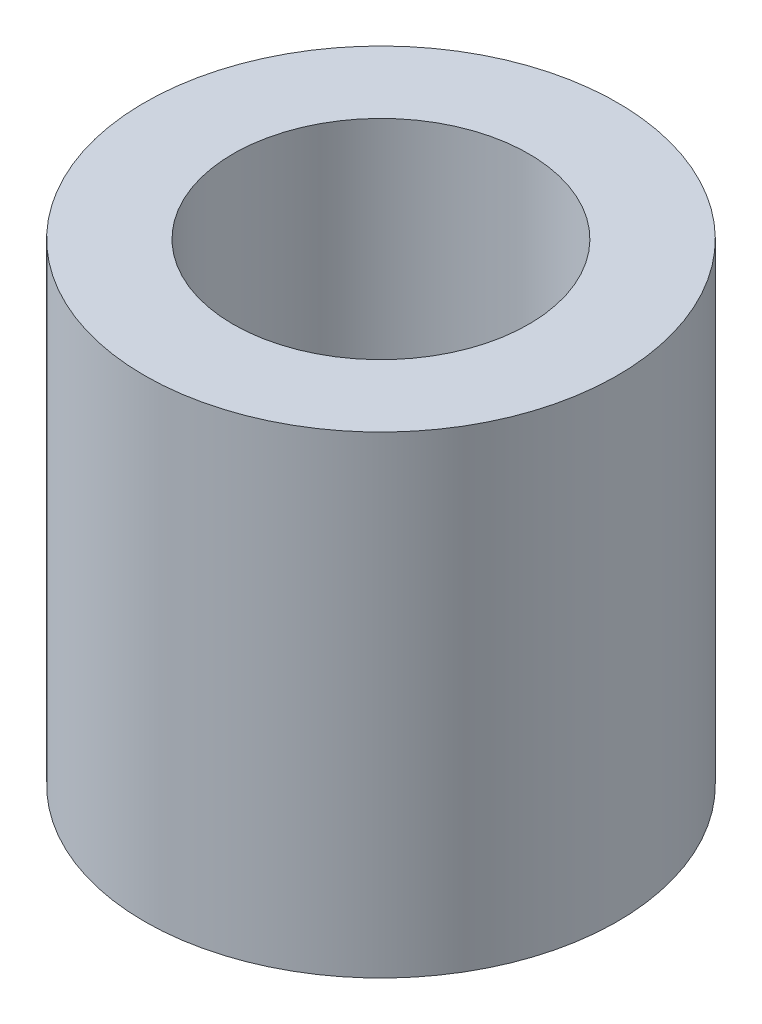
ISO-10303-21;
HEADER;
FILE_DESCRIPTION(('STEP AP214'),'2;1');
FILE_NAME('part.step','',(''),(''),'','','');
FILE_SCHEMA(('AUTOMOTIVE_DESIGN { 1 0 10303 214 1 1 1 1 }'));
ENDSEC;
DATA;
#1=APPLICATION_CONTEXT('core data for automotive mechanical design processes');
#2=APPLICATION_PROTOCOL_DEFINITION('international standard','automotive_design',2000,#1);
#3=PRODUCT_CONTEXT('',#1,'mechanical');
#4=PRODUCT('Part','Part','',(#3));
#5=PRODUCT_RELATED_PRODUCT_CATEGORY('part','',(#4));
#6=PRODUCT_DEFINITION_FORMATION('','',#4);
#7=PRODUCT_DEFINITION_CONTEXT('part definition',#1,'design');
#8=PRODUCT_DEFINITION('design','',#6,#7);
#9=PRODUCT_DEFINITION_SHAPE('','',#8);
#10=(LENGTH_UNIT() NAMED_UNIT(*) SI_UNIT(.MILLI.,.METRE.));
#11=(NAMED_UNIT(*) PLANE_ANGLE_UNIT() SI_UNIT($,.RADIAN.));
#12=(NAMED_UNIT(*) SI_UNIT($,.STERADIAN.) SOLID_ANGLE_UNIT());
#13=UNCERTAINTY_MEASURE_WITH_UNIT(LENGTH_MEASURE(1.E-05),#10,'distance_accuracy_value','');
#14=(GEOMETRIC_REPRESENTATION_CONTEXT(3) GLOBAL_UNCERTAINTY_ASSIGNED_CONTEXT((#13)) GLOBAL_UNIT_ASSIGNED_CONTEXT((#10,
#11,#12)) REPRESENTATION_CONTEXT('',''));
#15=CARTESIAN_POINT('',(0.,0.,0.));
#16=DIRECTION('',(0.,0.,1.));
#17=DIRECTION('',(1.,0.,0.));
#18=AXIS2_PLACEMENT_3D('',#15,#16,#17);
#19=CARTESIAN_POINT('',(0.,8.,0.));
#20=DIRECTION('',(0.,1.,0.));
#21=DIRECTION('',(0.,0.,1.));
#22=AXIS2_PLACEMENT_3D('',#19,#20,#21);
#23=PLANE('',#22);
#24=CARTESIAN_POINT('',(0.,8.,0.));
#25=DIRECTION('',(0.,1.,0.));
#26=DIRECTION('',(0.,0.,1.));
#27=AXIS2_PLACEMENT_3D('',#24,#25,#26);
#28=CIRCLE('',#27,4.);
#29=CARTESIAN_POINT('',(0.,8.,4.));
#30=VERTEX_POINT('',#29);
#31=EDGE_CURVE('E10',#30,#30,#28,.T.);
#32=ORIENTED_EDGE('',*,*,#31,.T.);
#33=EDGE_LOOP('',(#32));
#34=FACE_BOUND('',#33,.T.);
#35=CARTESIAN_POINT('',(0.,8.,0.));
#36=DIRECTION('',(0.,1.,0.));
#37=DIRECTION('',(0.,0.,1.));
#38=AXIS2_PLACEMENT_3D('',#35,#36,#37);
#39=CIRCLE('',#38,2.5);
#40=CARTESIAN_POINT('',(0.,8.,2.5));
#41=VERTEX_POINT('',#40);
#42=EDGE_CURVE('E44',#41,#41,#39,.T.);
#43=ORIENTED_EDGE('',*,*,#42,.F.);
#44=EDGE_LOOP('',(#43));
#45=FACE_BOUND('',#44,.T.);
#46=ADVANCED_FACE('F33',(#34,#45),#23,.T.);
#47=CARTESIAN_POINT('',(0.,0.,0.));
#48=DIRECTION('',(0.,1.,0.));
#49=DIRECTION('',(0.,0.,1.));
#50=AXIS2_PLACEMENT_3D('',#47,#48,#49);
#51=PLANE('',#50);
#52=CARTESIAN_POINT('',(0.,0.,0.));
#53=DIRECTION('',(0.,1.,0.));
#54=DIRECTION('',(0.,0.,1.));
#55=AXIS2_PLACEMENT_3D('',#52,#53,#54);
#56=CIRCLE('',#55,4.);
#57=CARTESIAN_POINT('',(0.,0.,4.));
#58=VERTEX_POINT('',#57);
#59=EDGE_CURVE('E37',#58,#58,#56,.T.);
#60=ORIENTED_EDGE('',*,*,#59,.F.);
#61=EDGE_LOOP('',(#60));
#62=FACE_BOUND('',#61,.T.);
#63=CARTESIAN_POINT('',(0.,0.,0.));
#64=DIRECTION('',(0.,1.,0.));
#65=DIRECTION('',(0.,0.,1.));
#66=AXIS2_PLACEMENT_3D('',#63,#64,#65);
#67=CIRCLE('',#66,2.5);
#68=CARTESIAN_POINT('',(0.,0.,2.5));
#69=VERTEX_POINT('',#68);
#70=EDGE_CURVE('E46',#69,#69,#67,.T.);
#71=ORIENTED_EDGE('',*,*,#70,.T.);
#72=EDGE_LOOP('',(#71));
#73=FACE_BOUND('',#72,.T.);
#74=ADVANCED_FACE('F56',(#62,#73),#51,.F.);
#75=CARTESIAN_POINT('',(0.,8.,0.));
#76=DIRECTION('',(0.,-1.,0.));
#77=DIRECTION('',(0.,0.,-1.));
#78=AXIS2_PLACEMENT_3D('',#75,#76,#77);
#79=CYLINDRICAL_SURFACE('',#78,4.);
#80=ORIENTED_EDGE('',*,*,#31,.F.);
#81=EDGE_LOOP('',(#80));
#82=FACE_BOUND('',#81,.T.);
#83=ORIENTED_EDGE('',*,*,#59,.T.);
#84=EDGE_LOOP('',(#83));
#85=FACE_BOUND('',#84,.T.);
#86=ADVANCED_FACE('F35',(#82,#85),#79,.T.);
#87=CARTESIAN_POINT('',(0.,8.,0.));
#88=DIRECTION('',(0.,-1.,0.));
#89=DIRECTION('',(0.,0.,-1.));
#90=AXIS2_PLACEMENT_3D('',#87,#88,#89);
#91=CYLINDRICAL_SURFACE('',#90,2.5);
#92=ORIENTED_EDGE('',*,*,#42,.T.);
#93=EDGE_LOOP('',(#92));
#94=FACE_BOUND('',#93,.T.);
#95=ORIENTED_EDGE('',*,*,#70,.F.);
#96=EDGE_LOOP('',(#95));
#97=FACE_BOUND('',#96,.T.);
#98=ADVANCED_FACE('F52',(#94,#97),#91,.F.);
#99=CLOSED_SHELL('',(#46,#74,#86,#98));
#100=MANIFOLD_SOLID_BREP('B2',#99);
#101=ADVANCED_BREP_SHAPE_REPRESENTATION('',(#18,#100),#14);
#102=SHAPE_DEFINITION_REPRESENTATION(#9,#101);
ENDSEC;
END-ISO-10303-21;
